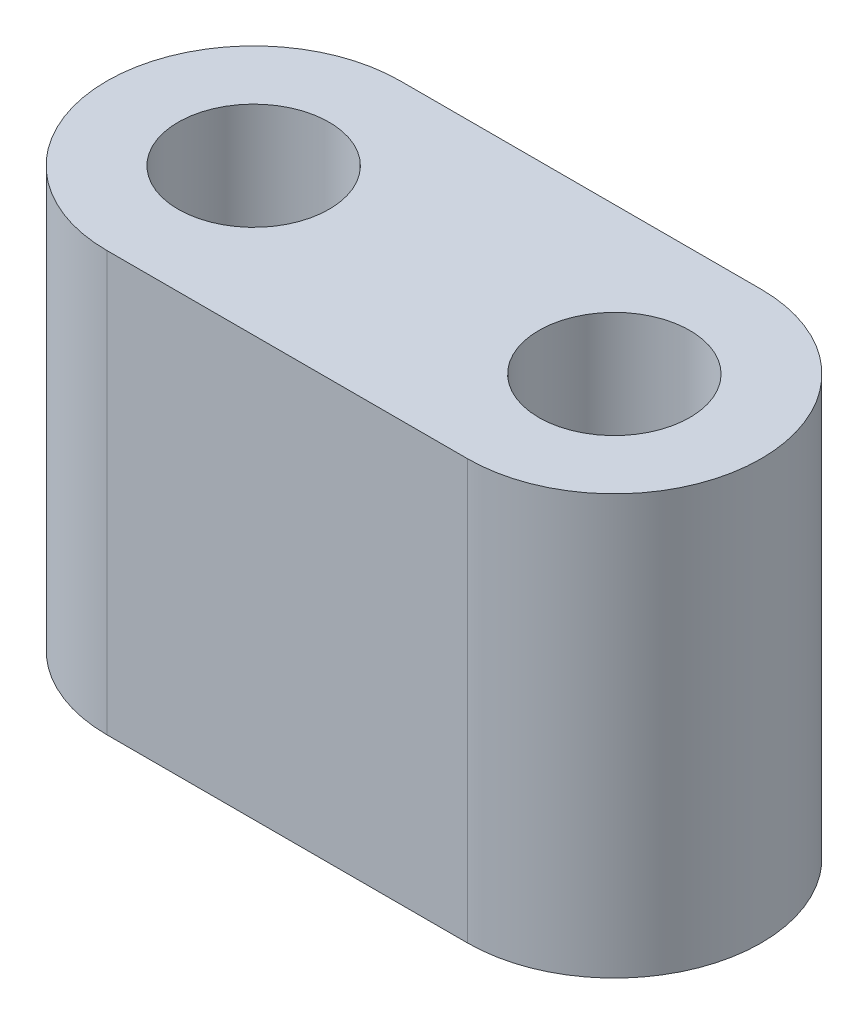
ISO-10303-21;
HEADER;
FILE_DESCRIPTION(('STEP AP214'),'2;1');
FILE_NAME('part.step','',(''),(''),'','','');
FILE_SCHEMA(('AUTOMOTIVE_DESIGN { 1 0 10303 214 1 1 1 1 }'));
ENDSEC;
DATA;
#1=APPLICATION_CONTEXT('core data for automotive mechanical design processes');
#2=APPLICATION_PROTOCOL_DEFINITION('international standard','automotive_design',2000,#1);
#3=PRODUCT_CONTEXT('',#1,'mechanical');
#4=PRODUCT('Part','Part','',(#3));
#5=PRODUCT_RELATED_PRODUCT_CATEGORY('part','',(#4));
#6=PRODUCT_DEFINITION_FORMATION('','',#4);
#7=PRODUCT_DEFINITION_CONTEXT('part definition',#1,'design');
#8=PRODUCT_DEFINITION('design','',#6,#7);
#9=PRODUCT_DEFINITION_SHAPE('','',#8);
#10=(LENGTH_UNIT() NAMED_UNIT(*) SI_UNIT(.MILLI.,.METRE.));
#11=(NAMED_UNIT(*) PLANE_ANGLE_UNIT() SI_UNIT($,.RADIAN.));
#12=(NAMED_UNIT(*) SI_UNIT($,.STERADIAN.) SOLID_ANGLE_UNIT());
#13=UNCERTAINTY_MEASURE_WITH_UNIT(LENGTH_MEASURE(1.E-05),#10,'distance_accuracy_value','');
#14=(GEOMETRIC_REPRESENTATION_CONTEXT(3) GLOBAL_UNCERTAINTY_ASSIGNED_CONTEXT((#13)) GLOBAL_UNIT_ASSIGNED_CONTEXT((#10,
#11,#12)) REPRESENTATION_CONTEXT('',''));
#15=CARTESIAN_POINT('',(0.,0.,0.));
#16=DIRECTION('',(0.,0.,1.));
#17=DIRECTION('',(1.,0.,0.));
#18=AXIS2_PLACEMENT_3D('',#15,#16,#17);
#19=CARTESIAN_POINT('',(-4.3,5.,0.));
#20=DIRECTION('',(0.,1.,0.));
#21=DIRECTION('',(0.,0.,1.));
#22=AXIS2_PLACEMENT_3D('',#19,#20,#21);
#23=PLANE('',#22);
#24=CARTESIAN_POINT('',(-4.3,5.,0.));
#25=DIRECTION('',(0.,1.,0.));
#26=DIRECTION('',(0.,0.,1.));
#27=AXIS2_PLACEMENT_3D('',#24,#25,#26);
#28=CIRCLE('',#27,1.8);
#29=CARTESIAN_POINT('',(-4.3,5.,1.8));
#30=VERTEX_POINT('',#29);
#31=EDGE_CURVE('E128',#30,#30,#28,.T.);
#32=ORIENTED_EDGE('',*,*,#31,.F.);
#33=EDGE_LOOP('',(#32));
#34=FACE_BOUND('',#33,.T.);
#35=CARTESIAN_POINT('',(-4.3,5.,0.));
#36=DIRECTION('',(0.,1.,0.));
#37=DIRECTION('',(0.,0.,1.));
#38=AXIS2_PLACEMENT_3D('',#35,#36,#37);
#39=CIRCLE('',#38,3.5);
#40=CARTESIAN_POINT('',(-4.3,5.,-3.5));
#41=VERTEX_POINT('',#40);
#42=CARTESIAN_POINT('',(-4.3,5.,3.5));
#43=VERTEX_POINT('',#42);
#44=EDGE_CURVE('E108',#41,#43,#39,.T.);
#45=ORIENTED_EDGE('',*,*,#44,.T.);
#46=DIRECTION('',(1.,0.,0.));
#47=VECTOR('',#46,1.);
#48=CARTESIAN_POINT('',(-4.3,5.,3.5));
#49=LINE('',#48,#47);
#50=CARTESIAN_POINT('',(4.3,5.,3.5));
#51=VERTEX_POINT('',#50);
#52=EDGE_CURVE('E102',#43,#51,#49,.T.);
#53=ORIENTED_EDGE('',*,*,#52,.T.);
#54=CARTESIAN_POINT('',(4.3,5.,0.));
#55=DIRECTION('',(0.,1.,0.));
#56=DIRECTION('',(0.,0.,1.));
#57=AXIS2_PLACEMENT_3D('',#54,#55,#56);
#58=CIRCLE('',#57,3.5);
#59=CARTESIAN_POINT('',(4.3,5.,-3.5));
#60=VERTEX_POINT('',#59);
#61=EDGE_CURVE('E106',#51,#60,#58,.T.);
#62=ORIENTED_EDGE('',*,*,#61,.T.);
#63=DIRECTION('',(-1.,0.,0.));
#64=VECTOR('',#63,1.);
#65=CARTESIAN_POINT('',(-4.3,5.,-3.5));
#66=LINE('',#65,#64);
#67=EDGE_CURVE('E68',#60,#41,#66,.T.);
#68=ORIENTED_EDGE('',*,*,#67,.T.);
#69=EDGE_LOOP('',(#45,#53,#62,#68));
#70=FACE_BOUND('',#69,.T.);
#71=CARTESIAN_POINT('',(4.3,5.,0.));
#72=DIRECTION('',(0.,1.,0.));
#73=DIRECTION('',(0.,0.,1.));
#74=AXIS2_PLACEMENT_3D('',#71,#72,#73);
#75=CIRCLE('',#74,1.8);
#76=CARTESIAN_POINT('',(4.3,5.,1.8));
#77=VERTEX_POINT('',#76);
#78=EDGE_CURVE('E150',#77,#77,#75,.T.);
#79=ORIENTED_EDGE('',*,*,#78,.F.);
#80=EDGE_LOOP('',(#79));
#81=FACE_BOUND('',#80,.T.);
#82=ADVANCED_FACE('F47',(#34,#70,#81),#23,.T.);
#83=CARTESIAN_POINT('',(-4.3,-5.,0.));
#84=DIRECTION('',(0.,1.,0.));
#85=DIRECTION('',(0.,0.,1.));
#86=AXIS2_PLACEMENT_3D('',#83,#84,#85);
#87=PLANE('',#86);
#88=CARTESIAN_POINT('',(-4.3,-5.,0.));
#89=DIRECTION('',(0.,1.,0.));
#90=DIRECTION('',(0.,0.,1.));
#91=AXIS2_PLACEMENT_3D('',#88,#89,#90);
#92=CIRCLE('',#91,3.5);
#93=CARTESIAN_POINT('',(-4.3,-5.,-3.5));
#94=VERTEX_POINT('',#93);
#95=CARTESIAN_POINT('',(-4.3,-5.,3.5));
#96=VERTEX_POINT('',#95);
#97=EDGE_CURVE('E124',#94,#96,#92,.T.);
#98=ORIENTED_EDGE('',*,*,#97,.F.);
#99=DIRECTION('',(-1.,0.,0.));
#100=VECTOR('',#99,1.);
#101=CARTESIAN_POINT('',(-4.3,-5.,-3.5));
#102=LINE('',#101,#100);
#103=CARTESIAN_POINT('',(4.3,-5.,-3.5));
#104=VERTEX_POINT('',#103);
#105=EDGE_CURVE('E94',#104,#94,#102,.T.);
#106=ORIENTED_EDGE('',*,*,#105,.F.);
#107=CARTESIAN_POINT('',(4.3,-5.,0.));
#108=DIRECTION('',(0.,1.,0.));
#109=DIRECTION('',(0.,0.,1.));
#110=AXIS2_PLACEMENT_3D('',#107,#108,#109);
#111=CIRCLE('',#110,3.5);
#112=CARTESIAN_POINT('',(4.3,-5.,3.5));
#113=VERTEX_POINT('',#112);
#114=EDGE_CURVE('E88',#113,#104,#111,.T.);
#115=ORIENTED_EDGE('',*,*,#114,.F.);
#116=DIRECTION('',(1.,0.,0.));
#117=VECTOR('',#116,1.);
#118=CARTESIAN_POINT('',(-4.3,-5.,3.5));
#119=LINE('',#118,#117);
#120=EDGE_CURVE('E113',#96,#113,#119,.T.);
#121=ORIENTED_EDGE('',*,*,#120,.F.);
#122=EDGE_LOOP('',(#98,#106,#115,#121));
#123=FACE_BOUND('',#122,.T.);
#124=CARTESIAN_POINT('',(-4.3,-5.,0.));
#125=DIRECTION('',(0.,1.,0.));
#126=DIRECTION('',(0.,0.,1.));
#127=AXIS2_PLACEMENT_3D('',#124,#125,#126);
#128=CIRCLE('',#127,1.8);
#129=CARTESIAN_POINT('',(-4.3,-5.,1.8));
#130=VERTEX_POINT('',#129);
#131=EDGE_CURVE('E146',#130,#130,#128,.T.);
#132=ORIENTED_EDGE('',*,*,#131,.T.);
#133=EDGE_LOOP('',(#132));
#134=FACE_BOUND('',#133,.T.);
#135=CARTESIAN_POINT('',(4.3,-5.,0.));
#136=DIRECTION('',(0.,1.,0.));
#137=DIRECTION('',(0.,0.,1.));
#138=AXIS2_PLACEMENT_3D('',#135,#136,#137);
#139=CIRCLE('',#138,1.8);
#140=CARTESIAN_POINT('',(4.3,-5.,1.8));
#141=VERTEX_POINT('',#140);
#142=EDGE_CURVE('E154',#141,#141,#139,.T.);
#143=ORIENTED_EDGE('',*,*,#142,.T.);
#144=EDGE_LOOP('',(#143));
#145=FACE_BOUND('',#144,.T.);
#146=ADVANCED_FACE('F141',(#123,#134,#145),#87,.F.);
#147=CARTESIAN_POINT('',(-4.3,5.,0.));
#148=DIRECTION('',(0.,-1.,0.));
#149=DIRECTION('',(0.,0.,-1.));
#150=AXIS2_PLACEMENT_3D('',#147,#148,#149);
#151=CYLINDRICAL_SURFACE('',#150,3.5);
#152=ORIENTED_EDGE('',*,*,#97,.T.);
#153=DIRECTION('',(0.,-1.,0.));
#154=VECTOR('',#153,1.);
#155=CARTESIAN_POINT('',(-4.3,5.,3.5));
#156=LINE('',#155,#154);
#157=EDGE_CURVE('E11',#43,#96,#156,.T.);
#158=ORIENTED_EDGE('',*,*,#157,.F.);
#159=ORIENTED_EDGE('',*,*,#44,.F.);
#160=DIRECTION('',(0.,-1.,0.));
#161=VECTOR('',#160,1.);
#162=CARTESIAN_POINT('',(-4.3,5.,-3.5));
#163=LINE('',#162,#161);
#164=EDGE_CURVE('E120',#41,#94,#163,.T.);
#165=ORIENTED_EDGE('',*,*,#164,.T.);
#166=EDGE_LOOP('',(#152,#158,#159,#165));
#167=FACE_BOUND('',#166,.T.);
#168=ADVANCED_FACE('F49',(#167),#151,.T.);
#169=CARTESIAN_POINT('',(-4.3,5.,3.5));
#170=DIRECTION('',(0.,0.,-1.));
#171=DIRECTION('',(-1.,0.,0.));
#172=AXIS2_PLACEMENT_3D('',#169,#170,#171);
#173=PLANE('',#172);
#174=ORIENTED_EDGE('',*,*,#120,.T.);
#175=DIRECTION('',(0.,-1.,0.));
#176=VECTOR('',#175,1.);
#177=CARTESIAN_POINT('',(4.3,5.,3.5));
#178=LINE('',#177,#176);
#179=EDGE_CURVE('E57',#51,#113,#178,.T.);
#180=ORIENTED_EDGE('',*,*,#179,.F.);
#181=ORIENTED_EDGE('',*,*,#52,.F.);
#182=ORIENTED_EDGE('',*,*,#157,.T.);
#183=EDGE_LOOP('',(#174,#180,#181,#182));
#184=FACE_BOUND('',#183,.T.);
#185=ADVANCED_FACE('F112',(#184),#173,.F.);
#186=CARTESIAN_POINT('',(4.3,5.,0.));
#187=DIRECTION('',(0.,-1.,0.));
#188=DIRECTION('',(0.,0.,-1.));
#189=AXIS2_PLACEMENT_3D('',#186,#187,#188);
#190=CYLINDRICAL_SURFACE('',#189,3.5);
#191=ORIENTED_EDGE('',*,*,#114,.T.);
#192=DIRECTION('',(0.,-1.,0.));
#193=VECTOR('',#192,1.);
#194=CARTESIAN_POINT('',(4.3,5.,-3.5));
#195=LINE('',#194,#193);
#196=EDGE_CURVE('E115',#60,#104,#195,.T.);
#197=ORIENTED_EDGE('',*,*,#196,.F.);
#198=ORIENTED_EDGE('',*,*,#61,.F.);
#199=ORIENTED_EDGE('',*,*,#179,.T.);
#200=EDGE_LOOP('',(#191,#197,#198,#199));
#201=FACE_BOUND('',#200,.T.);
#202=ADVANCED_FACE('F116',(#201),#190,.T.);
#203=CARTESIAN_POINT('',(-4.3,5.,-3.5));
#204=DIRECTION('',(0.,0.,1.));
#205=DIRECTION('',(1.,0.,0.));
#206=AXIS2_PLACEMENT_3D('',#203,#204,#205);
#207=PLANE('',#206);
#208=ORIENTED_EDGE('',*,*,#105,.T.);
#209=ORIENTED_EDGE('',*,*,#164,.F.);
#210=ORIENTED_EDGE('',*,*,#67,.F.);
#211=ORIENTED_EDGE('',*,*,#196,.T.);
#212=EDGE_LOOP('',(#208,#209,#210,#211));
#213=FACE_BOUND('',#212,.T.);
#214=ADVANCED_FACE('F138',(#213),#207,.F.);
#215=CARTESIAN_POINT('',(-4.3,5.,0.));
#216=DIRECTION('',(0.,-1.,0.));
#217=DIRECTION('',(0.,0.,-1.));
#218=AXIS2_PLACEMENT_3D('',#215,#216,#217);
#219=CYLINDRICAL_SURFACE('',#218,1.8);
#220=ORIENTED_EDGE('',*,*,#31,.T.);
#221=EDGE_LOOP('',(#220));
#222=FACE_BOUND('',#221,.T.);
#223=ORIENTED_EDGE('',*,*,#131,.F.);
#224=EDGE_LOOP('',(#223));
#225=FACE_BOUND('',#224,.T.);
#226=ADVANCED_FACE('F173',(#222,#225),#219,.F.);
#227=CARTESIAN_POINT('',(4.3,5.,0.));
#228=DIRECTION('',(0.,-1.,0.));
#229=DIRECTION('',(0.,0.,-1.));
#230=AXIS2_PLACEMENT_3D('',#227,#228,#229);
#231=CYLINDRICAL_SURFACE('',#230,1.8);
#232=ORIENTED_EDGE('',*,*,#78,.T.);
#233=EDGE_LOOP('',(#232));
#234=FACE_BOUND('',#233,.T.);
#235=ORIENTED_EDGE('',*,*,#142,.F.);
#236=EDGE_LOOP('',(#235));
#237=FACE_BOUND('',#236,.T.);
#238=ADVANCED_FACE('F162',(#234,#237),#231,.F.);
#239=CLOSED_SHELL('',(#82,#146,#168,#185,#202,#214,#226,#238));
#240=MANIFOLD_SOLID_BREP('B2',#239);
#241=ADVANCED_BREP_SHAPE_REPRESENTATION('',(#18,#240),#14);
#242=SHAPE_DEFINITION_REPRESENTATION(#9,#241);
ENDSEC;
END-ISO-10303-21;
